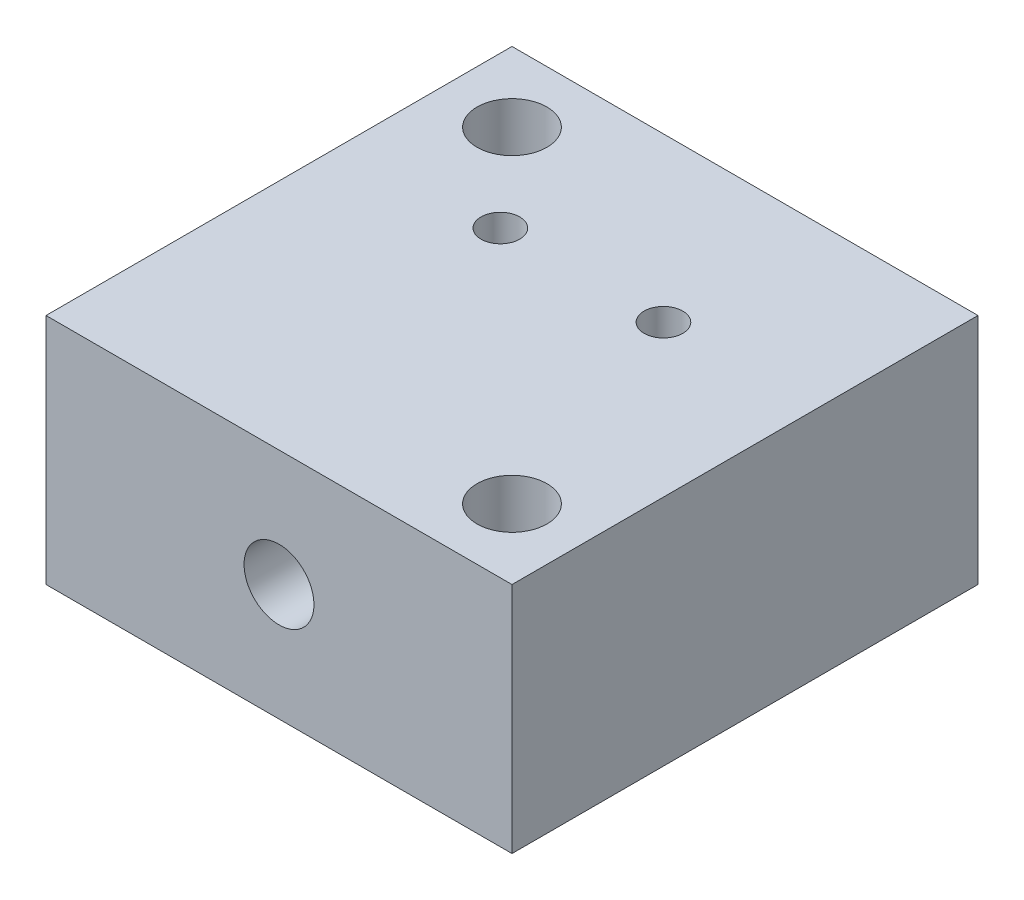
ISO-10303-21;
HEADER;
FILE_DESCRIPTION(('STEP AP214'),'2;1');
FILE_NAME('part.step','',(''),(''),'','','');
FILE_SCHEMA(('AUTOMOTIVE_DESIGN { 1 0 10303 214 1 1 1 1 }'));
ENDSEC;
DATA;
#1=APPLICATION_CONTEXT('core data for automotive mechanical design processes');
#2=APPLICATION_PROTOCOL_DEFINITION('international standard','automotive_design',2000,#1);
#3=PRODUCT_CONTEXT('',#1,'mechanical');
#4=PRODUCT('Part','Part','',(#3));
#5=PRODUCT_RELATED_PRODUCT_CATEGORY('part','',(#4));
#6=PRODUCT_DEFINITION_FORMATION('','',#4);
#7=PRODUCT_DEFINITION_CONTEXT('part definition',#1,'design');
#8=PRODUCT_DEFINITION('design','',#6,#7);
#9=PRODUCT_DEFINITION_SHAPE('','',#8);
#10=(LENGTH_UNIT() NAMED_UNIT(*) SI_UNIT(.MILLI.,.METRE.));
#11=(NAMED_UNIT(*) PLANE_ANGLE_UNIT() SI_UNIT($,.RADIAN.));
#12=(NAMED_UNIT(*) SI_UNIT($,.STERADIAN.) SOLID_ANGLE_UNIT());
#13=UNCERTAINTY_MEASURE_WITH_UNIT(LENGTH_MEASURE(1.E-05),#10,'distance_accuracy_value','');
#14=(GEOMETRIC_REPRESENTATION_CONTEXT(3) GLOBAL_UNCERTAINTY_ASSIGNED_CONTEXT((#13)) GLOBAL_UNIT_ASSIGNED_CONTEXT((#10,
#11,#12)) REPRESENTATION_CONTEXT('',''));
#15=CARTESIAN_POINT('',(0.,0.,0.));
#16=DIRECTION('',(0.,0.,1.));
#17=DIRECTION('',(1.,0.,0.));
#18=AXIS2_PLACEMENT_3D('',#15,#16,#17);
#19=CARTESIAN_POINT('',(0.,0.,0.));
#20=DIRECTION('',(0.,0.,1.));
#21=DIRECTION('',(1.,0.,0.));
#22=AXIS2_PLACEMENT_3D('',#19,#20,#21);
#23=PLANE('',#22);
#24=CARTESIAN_POINT('',(0.,0.,0.));
#25=DIRECTION('',(0.,0.,1.));
#26=DIRECTION('',(1.,0.,0.));
#27=AXIS2_PLACEMENT_3D('',#24,#25,#26);
#28=CIRCLE('',#27,7.49999999999999);
#29=CARTESIAN_POINT('',(7.49999999999999,0.,0.));
#30=VERTEX_POINT('',#29);
#31=EDGE_CURVE('E36',#30,#30,#28,.T.);
#32=ORIENTED_EDGE('',*,*,#31,.T.);
#33=EDGE_LOOP('',(#32));
#34=FACE_BOUND('',#33,.T.);
#35=DIRECTION('',(0.,-1.,0.));
#36=VECTOR('',#35,1.);
#37=CARTESIAN_POINT('',(-50.,-25.,0.));
#38=LINE('',#37,#36);
#39=CARTESIAN_POINT('',(-50.,25.,0.));
#40=VERTEX_POINT('',#39);
#41=CARTESIAN_POINT('',(-50.,-25.,0.));
#42=VERTEX_POINT('',#41);
#43=EDGE_CURVE('E136',#40,#42,#38,.T.);
#44=ORIENTED_EDGE('',*,*,#43,.F.);
#45=DIRECTION('',(-1.,0.,0.));
#46=VECTOR('',#45,1.);
#47=CARTESIAN_POINT('',(50.,25.,0.));
#48=LINE('',#47,#46);
#49=CARTESIAN_POINT('',(50.,25.,0.));
#50=VERTEX_POINT('',#49);
#51=EDGE_CURVE('E74',#50,#40,#48,.T.);
#52=ORIENTED_EDGE('',*,*,#51,.F.);
#53=DIRECTION('',(0.,1.,0.));
#54=VECTOR('',#53,1.);
#55=CARTESIAN_POINT('',(50.,-25.,0.));
#56=LINE('',#55,#54);
#57=CARTESIAN_POINT('',(50.,-25.,0.));
#58=VERTEX_POINT('',#57);
#59=EDGE_CURVE('E68',#58,#50,#56,.T.);
#60=ORIENTED_EDGE('',*,*,#59,.F.);
#61=DIRECTION('',(1.,0.,0.));
#62=VECTOR('',#61,1.);
#63=CARTESIAN_POINT('',(50.,-25.,0.));
#64=LINE('',#63,#62);
#65=EDGE_CURVE('E146',#42,#58,#64,.T.);
#66=ORIENTED_EDGE('',*,*,#65,.F.);
#67=EDGE_LOOP('',(#44,#52,#60,#66));
#68=FACE_BOUND('',#67,.T.);
#69=ADVANCED_FACE('F32',(#34,#68),#23,.F.);
#70=CARTESIAN_POINT('',(-50.,-25.,100.));
#71=DIRECTION('',(1.,0.,0.));
#72=DIRECTION('',(0.,1.,0.));
#73=AXIS2_PLACEMENT_3D('',#70,#71,#72);
#74=PLANE('',#73);
#75=ORIENTED_EDGE('',*,*,#43,.T.);
#76=DIRECTION('',(0.,0.,-1.));
#77=VECTOR('',#76,1.);
#78=CARTESIAN_POINT('',(-50.,-25.,100.));
#79=LINE('',#78,#77);
#80=CARTESIAN_POINT('',(-50.,-25.,100.));
#81=VERTEX_POINT('',#80);
#82=EDGE_CURVE('E11',#81,#42,#79,.T.);
#83=ORIENTED_EDGE('',*,*,#82,.F.);
#84=DIRECTION('',(0.,-1.,0.));
#85=VECTOR('',#84,1.);
#86=CARTESIAN_POINT('',(-50.,-25.,100.));
#87=LINE('',#86,#85);
#88=CARTESIAN_POINT('',(-50.,25.,100.));
#89=VERTEX_POINT('',#88);
#90=EDGE_CURVE('E137',#89,#81,#87,.T.);
#91=ORIENTED_EDGE('',*,*,#90,.F.);
#92=DIRECTION('',(0.,0.,-1.));
#93=VECTOR('',#92,1.);
#94=CARTESIAN_POINT('',(-50.,25.,100.));
#95=LINE('',#94,#93);
#96=EDGE_CURVE('E143',#89,#40,#95,.T.);
#97=ORIENTED_EDGE('',*,*,#96,.T.);
#98=EDGE_LOOP('',(#75,#83,#91,#97));
#99=FACE_BOUND('',#98,.T.);
#100=ADVANCED_FACE('F34',(#99),#74,.F.);
#101=CARTESIAN_POINT('',(50.,-25.,100.));
#102=DIRECTION('',(0.,1.,0.));
#103=DIRECTION('',(-1.,0.,0.));
#104=AXIS2_PLACEMENT_3D('',#101,#102,#103);
#105=PLANE('',#104);
#106=CARTESIAN_POINT('',(35.,-25.,85.));
#107=DIRECTION('',(0.,1.,0.));
#108=DIRECTION('',(0.,0.,1.));
#109=AXIS2_PLACEMENT_3D('',#106,#107,#108);
#110=CIRCLE('',#109,4.49999999999999);
#111=CARTESIAN_POINT('',(35.,-25.,89.5));
#112=VERTEX_POINT('',#111);
#113=EDGE_CURVE('E121',#112,#112,#110,.T.);
#114=ORIENTED_EDGE('',*,*,#113,.T.);
#115=EDGE_LOOP('',(#114));
#116=FACE_BOUND('',#115,.T.);
#117=CARTESIAN_POINT('',(-35.,-25.,15.));
#118=DIRECTION('',(0.,1.,0.));
#119=DIRECTION('',(0.,0.,1.));
#120=AXIS2_PLACEMENT_3D('',#117,#118,#119);
#121=CIRCLE('',#120,4.49999999999999);
#122=CARTESIAN_POINT('',(-35.,-25.,19.5));
#123=VERTEX_POINT('',#122);
#124=EDGE_CURVE('E133',#123,#123,#121,.T.);
#125=ORIENTED_EDGE('',*,*,#124,.T.);
#126=EDGE_LOOP('',(#125));
#127=FACE_BOUND('',#126,.T.);
#128=ORIENTED_EDGE('',*,*,#65,.T.);
#129=DIRECTION('',(0.,0.,-1.));
#130=VECTOR('',#129,1.);
#131=CARTESIAN_POINT('',(50.,-25.,100.));
#132=LINE('',#131,#130);
#133=CARTESIAN_POINT('',(50.,-25.,100.));
#134=VERTEX_POINT('',#133);
#135=EDGE_CURVE('E42',#134,#58,#132,.T.);
#136=ORIENTED_EDGE('',*,*,#135,.F.);
#137=DIRECTION('',(1.,0.,0.));
#138=VECTOR('',#137,1.);
#139=CARTESIAN_POINT('',(50.,-25.,100.));
#140=LINE('',#139,#138);
#141=EDGE_CURVE('E81',#81,#134,#140,.T.);
#142=ORIENTED_EDGE('',*,*,#141,.F.);
#143=ORIENTED_EDGE('',*,*,#82,.T.);
#144=EDGE_LOOP('',(#128,#136,#142,#143));
#145=FACE_BOUND('',#144,.T.);
#146=ADVANCED_FACE('F174',(#116,#127,#145),#105,.F.);
#147=CARTESIAN_POINT('',(50.,-25.,100.));
#148=DIRECTION('',(-1.,0.,0.));
#149=DIRECTION('',(0.,-1.,0.));
#150=AXIS2_PLACEMENT_3D('',#147,#148,#149);
#151=PLANE('',#150);
#152=ORIENTED_EDGE('',*,*,#59,.T.);
#153=DIRECTION('',(0.,0.,-1.));
#154=VECTOR('',#153,1.);
#155=CARTESIAN_POINT('',(50.,25.,100.));
#156=LINE('',#155,#154);
#157=CARTESIAN_POINT('',(50.,25.,100.));
#158=VERTEX_POINT('',#157);
#159=EDGE_CURVE('E151',#158,#50,#156,.T.);
#160=ORIENTED_EDGE('',*,*,#159,.F.);
#161=DIRECTION('',(0.,1.,0.));
#162=VECTOR('',#161,1.);
#163=CARTESIAN_POINT('',(50.,-25.,100.));
#164=LINE('',#163,#162);
#165=EDGE_CURVE('E140',#134,#158,#164,.T.);
#166=ORIENTED_EDGE('',*,*,#165,.F.);
#167=ORIENTED_EDGE('',*,*,#135,.T.);
#168=EDGE_LOOP('',(#152,#160,#166,#167));
#169=FACE_BOUND('',#168,.T.);
#170=ADVANCED_FACE('F154',(#169),#151,.F.);
#171=CARTESIAN_POINT('',(50.,25.,100.));
#172=DIRECTION('',(0.,-1.,0.));
#173=DIRECTION('',(1.,0.,0.));
#174=AXIS2_PLACEMENT_3D('',#171,#172,#173);
#175=PLANE('',#174);
#176=CARTESIAN_POINT('',(-17.5,25.,35.));
#177=DIRECTION('',(0.,1.,0.));
#178=DIRECTION('',(0.,0.,1.));
#179=AXIS2_PLACEMENT_3D('',#176,#177,#178);
#180=CIRCLE('',#179,4.14999999999999);
#181=CARTESIAN_POINT('',(-17.5,25.,39.15));
#182=VERTEX_POINT('',#181);
#183=EDGE_CURVE('E99',#182,#182,#180,.T.);
#184=ORIENTED_EDGE('',*,*,#183,.F.);
#185=EDGE_LOOP('',(#184));
#186=FACE_BOUND('',#185,.T.);
#187=CARTESIAN_POINT('',(17.5,25.,35.));
#188=DIRECTION('',(0.,1.,0.));
#189=DIRECTION('',(0.,0.,1.));
#190=AXIS2_PLACEMENT_3D('',#187,#188,#189);
#191=CIRCLE('',#190,4.14999999999999);
#192=CARTESIAN_POINT('',(17.5,25.,39.15));
#193=VERTEX_POINT('',#192);
#194=EDGE_CURVE('E98',#193,#193,#191,.T.);
#195=ORIENTED_EDGE('',*,*,#194,.F.);
#196=EDGE_LOOP('',(#195));
#197=FACE_BOUND('',#196,.T.);
#198=CARTESIAN_POINT('',(35.,25.,85.));
#199=DIRECTION('',(0.,1.,0.));
#200=DIRECTION('',(0.,0.,1.));
#201=AXIS2_PLACEMENT_3D('',#198,#199,#200);
#202=CIRCLE('',#201,7.49999999999999);
#203=CARTESIAN_POINT('',(35.,25.,92.5));
#204=VERTEX_POINT('',#203);
#205=EDGE_CURVE('E112',#204,#204,#202,.T.);
#206=ORIENTED_EDGE('',*,*,#205,.F.);
#207=EDGE_LOOP('',(#206));
#208=FACE_BOUND('',#207,.T.);
#209=CARTESIAN_POINT('',(-35.,25.,15.));
#210=DIRECTION('',(0.,1.,0.));
#211=DIRECTION('',(0.,0.,1.));
#212=AXIS2_PLACEMENT_3D('',#209,#210,#211);
#213=CIRCLE('',#212,7.5);
#214=CARTESIAN_POINT('',(-35.,25.,22.5));
#215=VERTEX_POINT('',#214);
#216=EDGE_CURVE('E124',#215,#215,#213,.T.);
#217=ORIENTED_EDGE('',*,*,#216,.F.);
#218=EDGE_LOOP('',(#217));
#219=FACE_BOUND('',#218,.T.);
#220=ORIENTED_EDGE('',*,*,#51,.T.);
#221=ORIENTED_EDGE('',*,*,#96,.F.);
#222=DIRECTION('',(-1.,0.,0.));
#223=VECTOR('',#222,1.);
#224=CARTESIAN_POINT('',(50.,25.,100.));
#225=LINE('',#224,#223);
#226=EDGE_CURVE('E50',#158,#89,#225,.T.);
#227=ORIENTED_EDGE('',*,*,#226,.F.);
#228=ORIENTED_EDGE('',*,*,#159,.T.);
#229=EDGE_LOOP('',(#220,#221,#227,#228));
#230=FACE_BOUND('',#229,.T.);
#231=ADVANCED_FACE('F160',(#186,#197,#208,#219,#230),#175,.F.);
#232=CARTESIAN_POINT('',(0.,0.,100.));
#233=DIRECTION('',(0.,0.,1.));
#234=DIRECTION('',(1.,0.,0.));
#235=AXIS2_PLACEMENT_3D('',#232,#233,#234);
#236=PLANE('',#235);
#237=CARTESIAN_POINT('',(0.,0.,100.));
#238=DIRECTION('',(0.,0.,1.));
#239=DIRECTION('',(1.,0.,0.));
#240=AXIS2_PLACEMENT_3D('',#237,#238,#239);
#241=CIRCLE('',#240,7.5);
#242=CARTESIAN_POINT('',(7.5,0.,100.));
#243=VERTEX_POINT('',#242);
#244=EDGE_CURVE('E109',#243,#243,#241,.T.);
#245=ORIENTED_EDGE('',*,*,#244,.F.);
#246=EDGE_LOOP('',(#245));
#247=FACE_BOUND('',#246,.T.);
#248=ORIENTED_EDGE('',*,*,#90,.T.);
#249=ORIENTED_EDGE('',*,*,#141,.T.);
#250=ORIENTED_EDGE('',*,*,#165,.T.);
#251=ORIENTED_EDGE('',*,*,#226,.T.);
#252=EDGE_LOOP('',(#248,#249,#250,#251));
#253=FACE_BOUND('',#252,.T.);
#254=ADVANCED_FACE('F162',(#247,#253),#236,.T.);
#255=CARTESIAN_POINT('',(-35.,25.,15.));
#256=DIRECTION('',(0.,1.,0.));
#257=DIRECTION('',(0.,0.,1.));
#258=AXIS2_PLACEMENT_3D('',#255,#256,#257);
#259=CYLINDRICAL_SURFACE('',#258,4.49999999999999);
#260=ORIENTED_EDGE('',*,*,#124,.F.);
#261=EDGE_LOOP('',(#260));
#262=FACE_BOUND('',#261,.T.);
#263=CARTESIAN_POINT('',(-35.,-20.,15.));
#264=DIRECTION('',(0.,1.,0.));
#265=DIRECTION('',(0.,0.,1.));
#266=AXIS2_PLACEMENT_3D('',#263,#264,#265);
#267=CIRCLE('',#266,4.49999999999999);
#268=CARTESIAN_POINT('',(-35.,-20.,19.5));
#269=VERTEX_POINT('',#268);
#270=EDGE_CURVE('E130',#269,#269,#267,.T.);
#271=ORIENTED_EDGE('',*,*,#270,.T.);
#272=EDGE_LOOP('',(#271));
#273=FACE_BOUND('',#272,.T.);
#274=ADVANCED_FACE('F170',(#262,#273),#259,.F.);
#275=CARTESIAN_POINT('',(-30.5,-20.,15.));
#276=DIRECTION('',(0.,-1.,0.));
#277=DIRECTION('',(0.,0.,-1.));
#278=AXIS2_PLACEMENT_3D('',#275,#276,#277);
#279=PLANE('',#278);
#280=ORIENTED_EDGE('',*,*,#270,.F.);
#281=EDGE_LOOP('',(#280));
#282=FACE_BOUND('',#281,.T.);
#283=CARTESIAN_POINT('',(-35.,-20.,15.));
#284=DIRECTION('',(0.,1.,0.));
#285=DIRECTION('',(0.,0.,1.));
#286=AXIS2_PLACEMENT_3D('',#283,#284,#285);
#287=CIRCLE('',#286,7.49999999999999);
#288=CARTESIAN_POINT('',(-35.,-20.,22.5));
#289=VERTEX_POINT('',#288);
#290=EDGE_CURVE('E127',#289,#289,#287,.T.);
#291=ORIENTED_EDGE('',*,*,#290,.T.);
#292=EDGE_LOOP('',(#291));
#293=FACE_BOUND('',#292,.T.);
#294=ADVANCED_FACE('F188',(#282,#293),#279,.F.);
#295=CARTESIAN_POINT('',(-35.,25.,15.));
#296=DIRECTION('',(0.,1.,0.));
#297=DIRECTION('',(0.,0.,1.));
#298=AXIS2_PLACEMENT_3D('',#295,#296,#297);
#299=CYLINDRICAL_SURFACE('',#298,7.49999999999999);
#300=ORIENTED_EDGE('',*,*,#290,.F.);
#301=EDGE_LOOP('',(#300));
#302=FACE_BOUND('',#301,.T.);
#303=ORIENTED_EDGE('',*,*,#216,.T.);
#304=EDGE_LOOP('',(#303));
#305=FACE_BOUND('',#304,.T.);
#306=ADVANCED_FACE('F192',(#302,#305),#299,.F.);
#307=CARTESIAN_POINT('',(35.,25.,85.));
#308=DIRECTION('',(0.,1.,0.));
#309=DIRECTION('',(0.,0.,1.));
#310=AXIS2_PLACEMENT_3D('',#307,#308,#309);
#311=CYLINDRICAL_SURFACE('',#310,4.49999999999999);
#312=ORIENTED_EDGE('',*,*,#113,.F.);
#313=EDGE_LOOP('',(#312));
#314=FACE_BOUND('',#313,.T.);
#315=CARTESIAN_POINT('',(35.,-20.,85.));
#316=DIRECTION('',(0.,1.,0.));
#317=DIRECTION('',(0.,0.,1.));
#318=AXIS2_PLACEMENT_3D('',#315,#316,#317);
#319=CIRCLE('',#318,4.49999999999999);
#320=CARTESIAN_POINT('',(35.,-20.,89.5));
#321=VERTEX_POINT('',#320);
#322=EDGE_CURVE('E118',#321,#321,#319,.T.);
#323=ORIENTED_EDGE('',*,*,#322,.T.);
#324=EDGE_LOOP('',(#323));
#325=FACE_BOUND('',#324,.T.);
#326=ADVANCED_FACE('F196',(#314,#325),#311,.F.);
#327=CARTESIAN_POINT('',(39.5,-20.,85.));
#328=DIRECTION('',(0.,-1.,0.));
#329=DIRECTION('',(0.,0.,-1.));
#330=AXIS2_PLACEMENT_3D('',#327,#328,#329);
#331=PLANE('',#330);
#332=ORIENTED_EDGE('',*,*,#322,.F.);
#333=EDGE_LOOP('',(#332));
#334=FACE_BOUND('',#333,.T.);
#335=CARTESIAN_POINT('',(35.,-20.,85.));
#336=DIRECTION('',(0.,1.,0.));
#337=DIRECTION('',(0.,0.,1.));
#338=AXIS2_PLACEMENT_3D('',#335,#336,#337);
#339=CIRCLE('',#338,7.49999999999999);
#340=CARTESIAN_POINT('',(35.,-20.,92.5));
#341=VERTEX_POINT('',#340);
#342=EDGE_CURVE('E115',#341,#341,#339,.T.);
#343=ORIENTED_EDGE('',*,*,#342,.T.);
#344=EDGE_LOOP('',(#343));
#345=FACE_BOUND('',#344,.T.);
#346=ADVANCED_FACE('F200',(#334,#345),#331,.F.);
#347=CARTESIAN_POINT('',(35.,25.,85.));
#348=DIRECTION('',(0.,1.,0.));
#349=DIRECTION('',(0.,0.,1.));
#350=AXIS2_PLACEMENT_3D('',#347,#348,#349);
#351=CYLINDRICAL_SURFACE('',#350,7.49999999999999);
#352=ORIENTED_EDGE('',*,*,#342,.F.);
#353=EDGE_LOOP('',(#352));
#354=FACE_BOUND('',#353,.T.);
#355=ORIENTED_EDGE('',*,*,#205,.T.);
#356=EDGE_LOOP('',(#355));
#357=FACE_BOUND('',#356,.T.);
#358=ADVANCED_FACE('F204',(#354,#357),#351,.F.);
#359=CARTESIAN_POINT('',(0.,0.,100.));
#360=DIRECTION('',(0.,0.,1.));
#361=DIRECTION('',(1.,0.,0.));
#362=AXIS2_PLACEMENT_3D('',#359,#360,#361);
#363=CYLINDRICAL_SURFACE('',#362,7.49999999999999);
#364=ORIENTED_EDGE('',*,*,#244,.T.);
#365=EDGE_LOOP('',(#364));
#366=FACE_BOUND('',#365,.T.);
#367=ORIENTED_EDGE('',*,*,#31,.F.);
#368=EDGE_LOOP('',(#367));
#369=FACE_BOUND('',#368,.T.);
#370=ADVANCED_FACE('F208',(#366,#369),#363,.F.);
#371=CARTESIAN_POINT('',(17.5,5.,35.));
#372=DIRECTION('',(0.,1.,0.));
#373=DIRECTION('',(0.,0.,1.));
#374=AXIS2_PLACEMENT_3D('',#371,#372,#373);
#375=CONICAL_SURFACE('',#374,4.14999999999999,1.02974425867665);
#376=CARTESIAN_POINT('',(17.5,2.50642843103562,35.));
#377=VERTEX_POINT('',#376);
#378=VERTEX_LOOP('',#377);
#379=FACE_BOUND('',#378,.T.);
#380=CARTESIAN_POINT('',(17.5,5.,35.));
#381=DIRECTION('',(0.,1.,0.));
#382=DIRECTION('',(0.,0.,1.));
#383=AXIS2_PLACEMENT_3D('',#380,#381,#382);
#384=CIRCLE('',#383,4.14999999999999);
#385=CARTESIAN_POINT('',(17.5,5.,39.15));
#386=VERTEX_POINT('',#385);
#387=EDGE_CURVE('E102',#386,#386,#384,.T.);
#388=ORIENTED_EDGE('',*,*,#387,.T.);
#389=EDGE_LOOP('',(#388));
#390=FACE_BOUND('',#389,.T.);
#391=ADVANCED_FACE('F212',(#379,#390),#375,.F.);
#392=CARTESIAN_POINT('',(17.5,25.,35.));
#393=DIRECTION('',(0.,1.,0.));
#394=DIRECTION('',(0.,0.,1.));
#395=AXIS2_PLACEMENT_3D('',#392,#393,#394);
#396=CYLINDRICAL_SURFACE('',#395,4.14999999999999);
#397=ORIENTED_EDGE('',*,*,#387,.F.);
#398=EDGE_LOOP('',(#397));
#399=FACE_BOUND('',#398,.T.);
#400=ORIENTED_EDGE('',*,*,#194,.T.);
#401=EDGE_LOOP('',(#400));
#402=FACE_BOUND('',#401,.T.);
#403=ADVANCED_FACE('F92',(#399,#402),#396,.F.);
#404=CARTESIAN_POINT('',(-17.5,5.,35.));
#405=DIRECTION('',(0.,1.,0.));
#406=DIRECTION('',(0.,0.,1.));
#407=AXIS2_PLACEMENT_3D('',#404,#405,#406);
#408=CONICAL_SURFACE('',#407,4.14999999999999,1.02974425867665);
#409=CARTESIAN_POINT('',(-17.5,2.50642843103562,35.));
#410=VERTEX_POINT('',#409);
#411=VERTEX_LOOP('',#410);
#412=FACE_BOUND('',#411,.T.);
#413=CARTESIAN_POINT('',(-17.5,5.,35.));
#414=DIRECTION('',(0.,1.,0.));
#415=DIRECTION('',(0.,0.,1.));
#416=AXIS2_PLACEMENT_3D('',#413,#414,#415);
#417=CIRCLE('',#416,4.14999999999999);
#418=CARTESIAN_POINT('',(-17.5,5.,39.15));
#419=VERTEX_POINT('',#418);
#420=EDGE_CURVE('E96',#419,#419,#417,.T.);
#421=ORIENTED_EDGE('',*,*,#420,.T.);
#422=EDGE_LOOP('',(#421));
#423=FACE_BOUND('',#422,.T.);
#424=ADVANCED_FACE('F88',(#412,#423),#408,.F.);
#425=CARTESIAN_POINT('',(-17.5,25.,35.));
#426=DIRECTION('',(0.,1.,0.));
#427=DIRECTION('',(0.,0.,1.));
#428=AXIS2_PLACEMENT_3D('',#425,#426,#427);
#429=CYLINDRICAL_SURFACE('',#428,4.14999999999999);
#430=ORIENTED_EDGE('',*,*,#420,.F.);
#431=EDGE_LOOP('',(#430));
#432=FACE_BOUND('',#431,.T.);
#433=ORIENTED_EDGE('',*,*,#183,.T.);
#434=EDGE_LOOP('',(#433));
#435=FACE_BOUND('',#434,.T.);
#436=ADVANCED_FACE('F91',(#432,#435),#429,.F.);
#437=CLOSED_SHELL('',(#69,#100,#146,#170,#231,#254,#274,#294,#306,#326,#346,#358,#370,#391,#403,
#424,#436));
#438=MANIFOLD_SOLID_BREP('B2',#437);
#439=ADVANCED_BREP_SHAPE_REPRESENTATION('',(#18,#438),#14);
#440=SHAPE_DEFINITION_REPRESENTATION(#9,#439);
ENDSEC;
END-ISO-10303-21;
